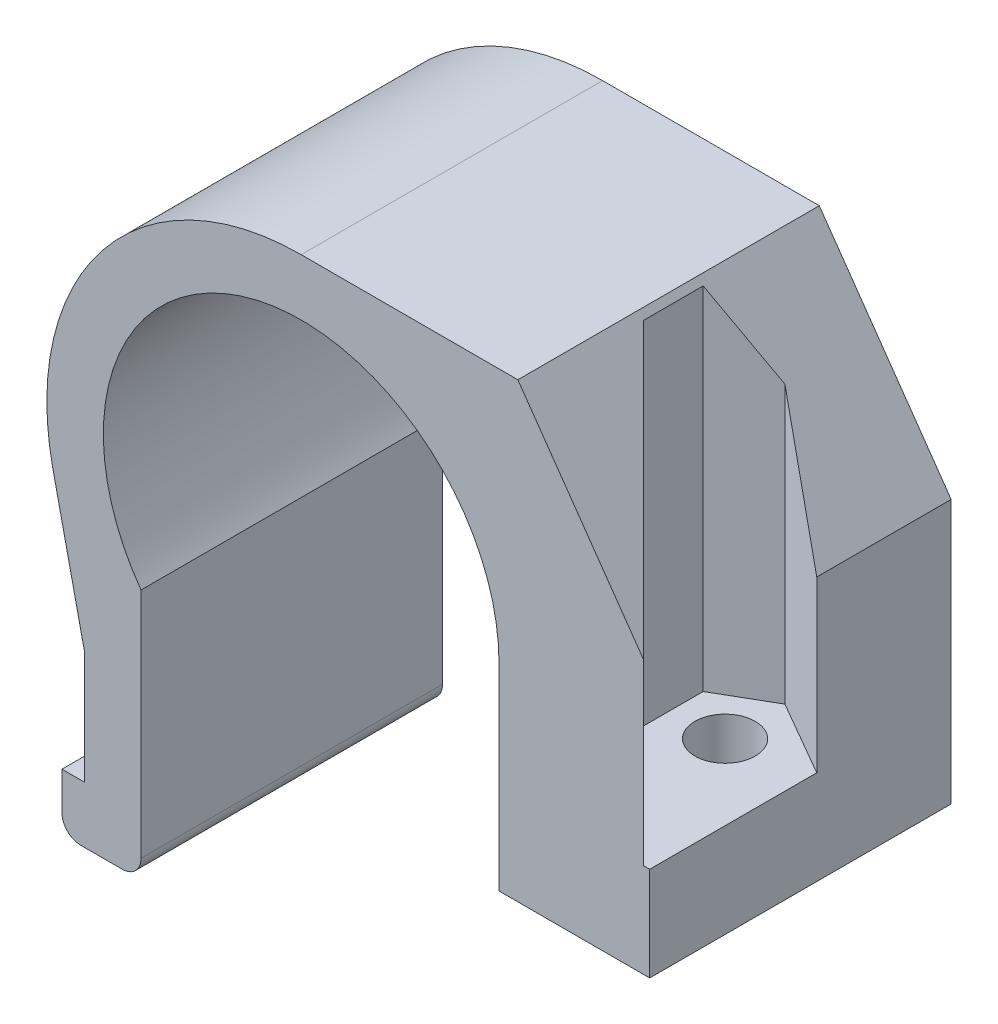
ISO-10303-21;
HEADER;
FILE_DESCRIPTION(('STEP AP214'),'2;1');
FILE_NAME('part.step','',(''),(''),'','','');
FILE_SCHEMA(('AUTOMOTIVE_DESIGN { 1 0 10303 214 1 1 1 1 }'));
ENDSEC;
DATA;
#1=APPLICATION_CONTEXT('core data for automotive mechanical design processes');
#2=APPLICATION_PROTOCOL_DEFINITION('international standard','automotive_design',2000,#1);
#3=PRODUCT_CONTEXT('',#1,'mechanical');
#4=PRODUCT('Part','Part','',(#3));
#5=PRODUCT_RELATED_PRODUCT_CATEGORY('part','',(#4));
#6=PRODUCT_DEFINITION_FORMATION('','',#4);
#7=PRODUCT_DEFINITION_CONTEXT('part definition',#1,'design');
#8=PRODUCT_DEFINITION('design','',#6,#7);
#9=PRODUCT_DEFINITION_SHAPE('','',#8);
#10=(LENGTH_UNIT() NAMED_UNIT(*) SI_UNIT(.MILLI.,.METRE.));
#11=(NAMED_UNIT(*) PLANE_ANGLE_UNIT() SI_UNIT($,.RADIAN.));
#12=(NAMED_UNIT(*) SI_UNIT($,.STERADIAN.) SOLID_ANGLE_UNIT());
#13=UNCERTAINTY_MEASURE_WITH_UNIT(LENGTH_MEASURE(1.E-05),#10,'distance_accuracy_value','');
#14=(GEOMETRIC_REPRESENTATION_CONTEXT(3) GLOBAL_UNCERTAINTY_ASSIGNED_CONTEXT((#13)) GLOBAL_UNIT_ASSIGNED_CONTEXT((#10,
#11,#12)) REPRESENTATION_CONTEXT('',''));
#15=CARTESIAN_POINT('',(0.,0.,0.));
#16=DIRECTION('',(0.,0.,1.));
#17=DIRECTION('',(1.,0.,0.));
#18=AXIS2_PLACEMENT_3D('',#15,#16,#17);
#19=CARTESIAN_POINT('',(14.5,13.5,8.));
#20=DIRECTION('',(0.,-1.,0.));
#21=DIRECTION('',(0.,0.,-1.));
#22=AXIS2_PLACEMENT_3D('',#19,#20,#21);
#23=CYLINDRICAL_SURFACE('',#22,1.6);
#24=CARTESIAN_POINT('',(14.5,-10.5,8.));
#25=DIRECTION('',(0.,-1.,0.));
#26=DIRECTION('',(0.,0.,-1.));
#27=AXIS2_PLACEMENT_3D('',#24,#25,#26);
#28=CIRCLE('',#27,1.6);
#29=CARTESIAN_POINT('',(14.5,-10.5,6.4));
#30=VERTEX_POINT('',#29);
#31=EDGE_CURVE('E257',#30,#30,#28,.T.);
#32=CARTESIAN_POINT('',(14.5,-5.5,8.));
#33=DIRECTION('',(0.,1.,0.));
#34=DIRECTION('',(0.,0.,1.));
#35=AXIS2_PLACEMENT_3D('',#32,#33,#34);
#36=CIRCLE('',#35,1.6);
#37=CARTESIAN_POINT('',(14.5,-5.50000000000001,6.4));
#38=VERTEX_POINT('',#37);
#39=EDGE_CURVE('E244',#38,#38,#36,.F.);
#40=CARTESIAN_POINT('',(14.5,-10.5,6.4));
#41=CARTESIAN_POINT('',(14.5,-10.4479166666667,6.4));
#42=CARTESIAN_POINT('',(14.5,-10.3958333333333,6.4));
#43=CARTESIAN_POINT('',(14.5,-10.2916666666667,6.4));
#44=CARTESIAN_POINT('',(14.5,-10.2395833333333,6.4));
#45=CARTESIAN_POINT('',(14.5,-10.1354166666667,6.4));
#46=CARTESIAN_POINT('',(14.5,-10.0833333333333,6.4));
#47=CARTESIAN_POINT('',(14.5,-9.97916666666667,6.4));
#48=CARTESIAN_POINT('',(14.5,-9.92708333333333,6.4));
#49=CARTESIAN_POINT('',(14.5,-9.82291666666667,6.4));
#50=CARTESIAN_POINT('',(14.5,-9.77083333333333,6.4));
#51=CARTESIAN_POINT('',(14.5,-9.66666666666667,6.4));
#52=CARTESIAN_POINT('',(14.5,-9.61458333333333,6.4));
#53=CARTESIAN_POINT('',(14.5,-9.51041666666667,6.4));
#54=CARTESIAN_POINT('',(14.5,-9.45833333333333,6.4));
#55=CARTESIAN_POINT('',(14.5,-9.35416666666667,6.4));
#56=CARTESIAN_POINT('',(14.5,-9.30208333333333,6.4));
#57=CARTESIAN_POINT('',(14.5,-9.19791666666667,6.4));
#58=CARTESIAN_POINT('',(14.5,-9.14583333333334,6.4));
#59=CARTESIAN_POINT('',(14.5,-9.04166666666667,6.4));
#60=CARTESIAN_POINT('',(14.5,-8.98958333333334,6.4));
#61=CARTESIAN_POINT('',(14.5,-8.88541666666667,6.4));
#62=CARTESIAN_POINT('',(14.5,-8.83333333333334,6.4));
#63=CARTESIAN_POINT('',(14.5,-8.72916666666667,6.4));
#64=CARTESIAN_POINT('',(14.5,-8.67708333333334,6.4));
#65=CARTESIAN_POINT('',(14.5,-8.57291666666667,6.4));
#66=CARTESIAN_POINT('',(14.5,-8.52083333333334,6.4));
#67=CARTESIAN_POINT('',(14.5,-8.41666666666667,6.4));
#68=CARTESIAN_POINT('',(14.5,-8.36458333333334,6.4));
#69=CARTESIAN_POINT('',(14.5,-8.26041666666667,6.4));
#70=CARTESIAN_POINT('',(14.5,-8.20833333333334,6.4));
#71=CARTESIAN_POINT('',(14.5,-8.10416666666667,6.4));
#72=CARTESIAN_POINT('',(14.5,-8.05208333333334,6.4));
#73=CARTESIAN_POINT('',(14.5,-7.94791666666667,6.4));
#74=CARTESIAN_POINT('',(14.5,-7.89583333333334,6.4));
#75=CARTESIAN_POINT('',(14.5,-7.79166666666667,6.4));
#76=CARTESIAN_POINT('',(14.5,-7.73958333333334,6.4));
#77=CARTESIAN_POINT('',(14.5,-7.63541666666667,6.4));
#78=CARTESIAN_POINT('',(14.5,-7.58333333333334,6.4));
#79=CARTESIAN_POINT('',(14.5,-7.47916666666667,6.4));
#80=CARTESIAN_POINT('',(14.5,-7.42708333333334,6.4));
#81=CARTESIAN_POINT('',(14.5,-7.32291666666667,6.4));
#82=CARTESIAN_POINT('',(14.5,-7.27083333333334,6.4));
#83=CARTESIAN_POINT('',(14.5,-7.16666666666667,6.4));
#84=CARTESIAN_POINT('',(14.5,-7.11458333333334,6.4));
#85=CARTESIAN_POINT('',(14.5,-7.01041666666667,6.4));
#86=CARTESIAN_POINT('',(14.5,-6.95833333333334,6.4));
#87=CARTESIAN_POINT('',(14.5,-6.85416666666667,6.4));
#88=CARTESIAN_POINT('',(14.5,-6.80208333333334,6.4));
#89=CARTESIAN_POINT('',(14.5,-6.69791666666667,6.4));
#90=CARTESIAN_POINT('',(14.5,-6.64583333333334,6.4));
#91=CARTESIAN_POINT('',(14.5,-6.54166666666667,6.4));
#92=CARTESIAN_POINT('',(14.5,-6.48958333333334,6.4));
#93=CARTESIAN_POINT('',(14.5,-6.38541666666667,6.4));
#94=CARTESIAN_POINT('',(14.5,-6.33333333333334,6.4));
#95=CARTESIAN_POINT('',(14.5,-6.22916666666667,6.4));
#96=CARTESIAN_POINT('',(14.5,-6.17708333333334,6.4));
#97=CARTESIAN_POINT('',(14.5,-6.07291666666667,6.4));
#98=CARTESIAN_POINT('',(14.5,-6.02083333333334,6.4));
#99=CARTESIAN_POINT('',(14.5,-5.91666666666667,6.4));
#100=CARTESIAN_POINT('',(14.5,-5.86458333333334,6.4));
#101=CARTESIAN_POINT('',(14.5,-5.76041666666667,6.4));
#102=CARTESIAN_POINT('',(14.5,-5.70833333333334,6.4));
#103=CARTESIAN_POINT('',(14.5,-5.60416666666667,6.4));
#104=CARTESIAN_POINT('',(14.5,-5.55208333333334,6.4));
#105=CARTESIAN_POINT('',(14.5,-5.50000000000001,6.4));
#106=B_SPLINE_CURVE_WITH_KNOTS('',3,(#40,#41,#42,#43,#44,#45,#46,#47,#48,#49,#50,#51,#52,#53,
#54,#55,#56,#57,#58,#59,#60,#61,#62,#63,#64,#65,#66,#67,#68,#69,#70,#71,#72,#73,#74,#75,#76,#77,
#78,#79,#80,#81,#82,#83,#84,#85,#86,#87,#88,#89,#90,#91,#92,#93,#94,#95,#96,#97,#98,#99,#100,
#101,#102,#103,#104,#105),.UNSPECIFIED.,.F.,.F.,(4,2,2,2,2,2,2,2,2,2,2,2,2,2,2,2,2,2,2,2,2,2,2,
2,2,2,2,2,2,2,2,2,4),(0.,0.15625,0.3125,0.46875,0.625000000000001,0.781250000000001,
0.937500000000001,1.09375,1.25,1.40625,1.5625,1.71875,1.875,2.03125,2.1875,2.34375,2.5,2.65625,
2.8125,2.96875,3.125,3.28125,3.4375,3.59375,3.75,3.90625,4.0625,4.21875,4.375,4.53125,4.6875,
4.84375,5.),.UNSPECIFIED.);
#107=EDGE_CURVE('BSEAM42',#30,#38,#106,.T.);
#108=ORIENTED_EDGE('',*,*,#31,.T.);
#109=ORIENTED_EDGE('',*,*,#39,.F.);
#110=ORIENTED_EDGE('',*,*,#107,.T.);
#111=ORIENTED_EDGE('',*,*,#107,.F.);
#112=EDGE_LOOP('',(#108,#110,#109,#111));
#113=FACE_BOUND('',#112,.T.);
#114=ADVANCED_FACE('F42',(#113),#23,.F.);
#115=CARTESIAN_POINT('',(-11.6977558947855,-18.5,16.));
#116=DIRECTION('',(0.,0.,-1.));
#117=DIRECTION('',(-1.,0.,0.));
#118=AXIS2_PLACEMENT_3D('',#115,#116,#117);
#119=CYLINDRICAL_SURFACE('',#118,1.);
#120=CARTESIAN_POINT('',(-11.6977558947855,-18.5,0.));
#121=DIRECTION('',(0.,0.,1.));
#122=DIRECTION('',(-1.,0.,0.));
#123=AXIS2_PLACEMENT_3D('',#120,#121,#122);
#124=CIRCLE('',#123,1.);
#125=CARTESIAN_POINT('',(-12.6977558947855,-18.5,0.));
#126=VERTEX_POINT('',#125);
#127=CARTESIAN_POINT('',(-11.6977558947855,-19.5,0.));
#128=VERTEX_POINT('',#127);
#129=EDGE_CURVE('E260',#126,#128,#124,.T.);
#130=ORIENTED_EDGE('',*,*,#129,.T.);
#131=DIRECTION('',(0.,0.,-1.));
#132=VECTOR('',#131,1.);
#133=CARTESIAN_POINT('',(-11.6977558947855,-19.5,16.));
#134=LINE('',#133,#132);
#135=CARTESIAN_POINT('',(-11.6977558947855,-19.5,16.));
#136=VERTEX_POINT('',#135);
#137=EDGE_CURVE('E380',#136,#128,#134,.T.);
#138=ORIENTED_EDGE('',*,*,#137,.F.);
#139=CARTESIAN_POINT('',(-11.6977558947855,-18.5,16.));
#140=DIRECTION('',(0.,0.,1.));
#141=DIRECTION('',(-1.,0.,0.));
#142=AXIS2_PLACEMENT_3D('',#139,#140,#141);
#143=CIRCLE('',#142,1.);
#144=CARTESIAN_POINT('',(-12.6977558947855,-18.5,16.));
#145=VERTEX_POINT('',#144);
#146=EDGE_CURVE('E261',#145,#136,#143,.T.);
#147=ORIENTED_EDGE('',*,*,#146,.F.);
#148=DIRECTION('',(0.,0.,-1.));
#149=VECTOR('',#148,1.);
#150=CARTESIAN_POINT('',(-12.6977558947855,-18.5,16.));
#151=LINE('',#150,#149);
#152=EDGE_CURVE('E303',#145,#126,#151,.T.);
#153=ORIENTED_EDGE('',*,*,#152,.T.);
#154=EDGE_LOOP('',(#130,#138,#147,#153));
#155=FACE_BOUND('',#154,.T.);
#156=ADVANCED_FACE('F447',(#155),#119,.T.);
#157=CARTESIAN_POINT('',(-8.49999999999999,-19.5,16.));
#158=DIRECTION('',(0.,1.,0.));
#159=DIRECTION('',(0.,0.,1.));
#160=AXIS2_PLACEMENT_3D('',#157,#158,#159);
#161=PLANE('',#160);
#162=DIRECTION('',(1.,0.,0.));
#163=VECTOR('',#162,1.);
#164=CARTESIAN_POINT('',(-8.49999999999999,-19.5,0.));
#165=LINE('',#164,#163);
#166=CARTESIAN_POINT('',(-9.49999999999999,-19.5,0.));
#167=VERTEX_POINT('',#166);
#168=EDGE_CURVE('E307',#128,#167,#165,.T.);
#169=ORIENTED_EDGE('',*,*,#168,.T.);
#170=DIRECTION('',(0.,0.,-1.));
#171=VECTOR('',#170,1.);
#172=CARTESIAN_POINT('',(-9.49999999999999,-19.5,16.));
#173=LINE('',#172,#171);
#174=CARTESIAN_POINT('',(-9.49999999999999,-19.5,16.));
#175=VERTEX_POINT('',#174);
#176=EDGE_CURVE('E51',#167,#175,#173,.F.);
#177=ORIENTED_EDGE('',*,*,#176,.T.);
#178=DIRECTION('',(1.,0.,0.));
#179=VECTOR('',#178,1.);
#180=CARTESIAN_POINT('',(-8.49999999999999,-19.5,16.));
#181=LINE('',#180,#179);
#182=EDGE_CURVE('E265',#136,#175,#181,.T.);
#183=ORIENTED_EDGE('',*,*,#182,.F.);
#184=ORIENTED_EDGE('',*,*,#137,.T.);
#185=EDGE_LOOP('',(#169,#177,#183,#184));
#186=FACE_BOUND('',#185,.T.);
#187=ADVANCED_FACE('F453',(#186),#161,.F.);
#188=CARTESIAN_POINT('',(-8.49999999999999,-6.16441400296899,16.));
#189=DIRECTION('',(-1.,0.,0.));
#190=DIRECTION('',(0.,-1.,0.));
#191=AXIS2_PLACEMENT_3D('',#188,#189,#190);
#192=PLANE('',#191);
#193=DIRECTION('',(0.,1.,0.));
#194=VECTOR('',#193,1.);
#195=CARTESIAN_POINT('',(-8.49999999999999,-6.16441400296899,16.));
#196=LINE('',#195,#194);
#197=CARTESIAN_POINT('',(-8.49999999999999,-18.5,16.));
#198=VERTEX_POINT('',#197);
#199=CARTESIAN_POINT('',(-8.49999999999999,-6.16441400296899,16.));
#200=VERTEX_POINT('',#199);
#201=EDGE_CURVE('E269',#198,#200,#196,.T.);
#202=ORIENTED_EDGE('',*,*,#201,.F.);
#203=DIRECTION('',(0.,0.,-1.));
#204=VECTOR('',#203,1.);
#205=CARTESIAN_POINT('',(-8.49999999999999,-18.5,16.));
#206=LINE('',#205,#204);
#207=CARTESIAN_POINT('',(-8.49999999999999,-18.5,0.));
#208=VERTEX_POINT('',#207);
#209=EDGE_CURVE('E411',#198,#208,#206,.T.);
#210=ORIENTED_EDGE('',*,*,#209,.T.);
#211=DIRECTION('',(0.,1.,0.));
#212=VECTOR('',#211,1.);
#213=CARTESIAN_POINT('',(-8.49999999999999,-6.16441400296899,0.));
#214=LINE('',#213,#212);
#215=CARTESIAN_POINT('',(-8.49999999999999,-6.16441400296899,0.));
#216=VERTEX_POINT('',#215);
#217=EDGE_CURVE('E310',#208,#216,#214,.T.);
#218=ORIENTED_EDGE('',*,*,#217,.T.);
#219=DIRECTION('',(0.,0.,-1.));
#220=VECTOR('',#219,1.);
#221=CARTESIAN_POINT('',(-8.49999999999999,-6.16441400296899,16.));
#222=LINE('',#221,#220);
#223=EDGE_CURVE('E376',#200,#216,#222,.T.);
#224=ORIENTED_EDGE('',*,*,#223,.F.);
#225=EDGE_LOOP('',(#202,#210,#218,#224));
#226=FACE_BOUND('',#225,.T.);
#227=ADVANCED_FACE('F420',(#226),#192,.F.);
#228=CARTESIAN_POINT('',(0.,0.,16.));
#229=DIRECTION('',(0.,0.,-1.));
#230=DIRECTION('',(-1.,0.,0.));
#231=AXIS2_PLACEMENT_3D('',#228,#229,#230);
#232=CYLINDRICAL_SURFACE('',#231,10.5);
#233=CARTESIAN_POINT('',(0.,0.,0.));
#234=DIRECTION('',(0.,0.,-1.));
#235=DIRECTION('',(1.,0.,0.));
#236=AXIS2_PLACEMENT_3D('',#233,#234,#235);
#237=CIRCLE('',#236,10.5);
#238=CARTESIAN_POINT('',(10.5,0.,0.));
#239=VERTEX_POINT('',#238);
#240=EDGE_CURVE('E313',#216,#239,#237,.T.);
#241=ORIENTED_EDGE('',*,*,#240,.T.);
#242=DIRECTION('',(0.,0.,-1.));
#243=VECTOR('',#242,1.);
#244=CARTESIAN_POINT('',(10.5,0.,16.));
#245=LINE('',#244,#243);
#246=CARTESIAN_POINT('',(10.5,0.,16.));
#247=VERTEX_POINT('',#246);
#248=EDGE_CURVE('E372',#247,#239,#245,.T.);
#249=ORIENTED_EDGE('',*,*,#248,.F.);
#250=CARTESIAN_POINT('',(0.,0.,16.));
#251=DIRECTION('',(0.,0.,-1.));
#252=DIRECTION('',(1.,0.,0.));
#253=AXIS2_PLACEMENT_3D('',#250,#251,#252);
#254=CIRCLE('',#253,10.5);
#255=EDGE_CURVE('E272',#200,#247,#254,.T.);
#256=ORIENTED_EDGE('',*,*,#255,.F.);
#257=ORIENTED_EDGE('',*,*,#223,.T.);
#258=EDGE_LOOP('',(#241,#249,#256,#257));
#259=FACE_BOUND('',#258,.T.);
#260=ADVANCED_FACE('F430',(#259),#232,.F.);
#261=CARTESIAN_POINT('',(10.5,0.,16.));
#262=DIRECTION('',(1.,0.,0.));
#263=DIRECTION('',(0.,0.,-1.));
#264=AXIS2_PLACEMENT_3D('',#261,#262,#263);
#265=PLANE('',#264);
#266=DIRECTION('',(0.,-1.,0.));
#267=VECTOR('',#266,1.);
#268=CARTESIAN_POINT('',(10.5,0.,0.));
#269=LINE('',#268,#267);
#270=CARTESIAN_POINT('',(10.5,-10.5,0.));
#271=VERTEX_POINT('',#270);
#272=EDGE_CURVE('E316',#239,#271,#269,.T.);
#273=ORIENTED_EDGE('',*,*,#272,.T.);
#274=DIRECTION('',(0.,0.,-1.));
#275=VECTOR('',#274,1.);
#276=CARTESIAN_POINT('',(10.5,-10.5,16.));
#277=LINE('',#276,#275);
#278=CARTESIAN_POINT('',(10.5,-10.5,16.));
#279=VERTEX_POINT('',#278);
#280=EDGE_CURVE('E369',#279,#271,#277,.T.);
#281=ORIENTED_EDGE('',*,*,#280,.F.);
#282=DIRECTION('',(0.,-1.,0.));
#283=VECTOR('',#282,1.);
#284=CARTESIAN_POINT('',(10.5,0.,16.));
#285=LINE('',#284,#283);
#286=EDGE_CURVE('E275',#247,#279,#285,.T.);
#287=ORIENTED_EDGE('',*,*,#286,.F.);
#288=ORIENTED_EDGE('',*,*,#248,.T.);
#289=EDGE_LOOP('',(#273,#281,#287,#288));
#290=FACE_BOUND('',#289,.T.);
#291=ADVANCED_FACE('F434',(#290),#265,.F.);
#292=CARTESIAN_POINT('',(10.5,-10.5,16.));
#293=DIRECTION('',(0.,1.,0.));
#294=DIRECTION('',(-1.,0.,0.));
#295=AXIS2_PLACEMENT_3D('',#292,#293,#294);
#296=PLANE('',#295);
#297=ORIENTED_EDGE('',*,*,#31,.F.);
#298=EDGE_LOOP('',(#297));
#299=FACE_BOUND('',#298,.T.);
#300=DIRECTION('',(1.,0.,0.));
#301=VECTOR('',#300,1.);
#302=CARTESIAN_POINT('',(10.5,-10.5,0.));
#303=LINE('',#302,#301);
#304=CARTESIAN_POINT('',(18.5,-10.5,0.));
#305=VERTEX_POINT('',#304);
#306=EDGE_CURVE('E319',#271,#305,#303,.T.);
#307=ORIENTED_EDGE('',*,*,#306,.T.);
#308=DIRECTION('',(0.,0.,-1.));
#309=VECTOR('',#308,1.);
#310=CARTESIAN_POINT('',(18.5,-10.5,16.));
#311=LINE('',#310,#309);
#312=CARTESIAN_POINT('',(18.5,-10.5,16.));
#313=VERTEX_POINT('',#312);
#314=EDGE_CURVE('E365',#313,#305,#311,.T.);
#315=ORIENTED_EDGE('',*,*,#314,.F.);
#316=DIRECTION('',(1.,0.,0.));
#317=VECTOR('',#316,1.);
#318=CARTESIAN_POINT('',(10.5,-10.5,16.));
#319=LINE('',#318,#317);
#320=EDGE_CURVE('E278',#279,#313,#319,.T.);
#321=ORIENTED_EDGE('',*,*,#320,.F.);
#322=ORIENTED_EDGE('',*,*,#280,.T.);
#323=EDGE_LOOP('',(#307,#315,#321,#322));
#324=FACE_BOUND('',#323,.T.);
#325=ADVANCED_FACE('F491',(#299,#324),#296,.F.);
#326=CARTESIAN_POINT('',(18.5,13.5,16.));
#327=DIRECTION('',(-1.,0.,0.));
#328=DIRECTION('',(0.,-1.,0.));
#329=AXIS2_PLACEMENT_3D('',#326,#327,#328);
#330=PLANE('',#329);
#331=DIRECTION('',(0.,0.,1.));
#332=VECTOR('',#331,1.);
#333=CARTESIAN_POINT('',(18.5,3.49999999999996,16.));
#334=LINE('',#333,#332);
#335=CARTESIAN_POINT('',(18.5,3.49999999999996,0.));
#336=VERTEX_POINT('',#335);
#337=CARTESIAN_POINT('',(18.5,3.49999999999996,7.13397459621556));
#338=VERTEX_POINT('',#337);
#339=EDGE_CURVE('E391',#336,#338,#334,.T.);
#340=ORIENTED_EDGE('',*,*,#339,.T.);
#341=DIRECTION('',(0.,-1.,0.));
#342=VECTOR('',#341,1.);
#343=CARTESIAN_POINT('',(18.5,13.5,7.13397459621556));
#344=LINE('',#343,#342);
#345=CARTESIAN_POINT('',(18.5,-5.5,7.13397459621556));
#346=VERTEX_POINT('',#345);
#347=EDGE_CURVE('E253',#338,#346,#344,.T.);
#348=ORIENTED_EDGE('',*,*,#347,.T.);
#349=DIRECTION('',(0.,0.,-1.));
#350=VECTOR('',#349,1.);
#351=CARTESIAN_POINT('',(18.5,-5.5,16.));
#352=LINE('',#351,#350);
#353=CARTESIAN_POINT('',(18.5,-5.5,16.));
#354=VERTEX_POINT('',#353);
#355=EDGE_CURVE('E249',#354,#346,#352,.T.);
#356=ORIENTED_EDGE('',*,*,#355,.F.);
#357=DIRECTION('',(0.,1.,0.));
#358=VECTOR('',#357,1.);
#359=CARTESIAN_POINT('',(18.5,13.5,16.));
#360=LINE('',#359,#358);
#361=EDGE_CURVE('E281',#313,#354,#360,.T.);
#362=ORIENTED_EDGE('',*,*,#361,.F.);
#363=ORIENTED_EDGE('',*,*,#314,.T.);
#364=DIRECTION('',(0.,1.,0.));
#365=VECTOR('',#364,1.);
#366=CARTESIAN_POINT('',(18.5,13.5,0.));
#367=LINE('',#366,#365);
#368=EDGE_CURVE('E321',#305,#336,#367,.T.);
#369=ORIENTED_EDGE('',*,*,#368,.T.);
#370=EDGE_LOOP('',(#340,#348,#356,#362,#363,#369));
#371=FACE_BOUND('',#370,.T.);
#372=ADVANCED_FACE('F487',(#371),#330,.F.);
#373=CARTESIAN_POINT('',(0.,13.5,16.));
#374=DIRECTION('',(0.,-1.,0.));
#375=DIRECTION('',(1.,0.,0.));
#376=AXIS2_PLACEMENT_3D('',#373,#374,#375);
#377=PLANE('',#376);
#378=DIRECTION('',(-1.,0.,0.));
#379=VECTOR('',#378,1.);
#380=CARTESIAN_POINT('',(0.,13.5,16.));
#381=LINE('',#380,#379);
#382=CARTESIAN_POINT('',(11.5,13.5,16.));
#383=VERTEX_POINT('',#382);
#384=CARTESIAN_POINT('',(0.,13.5,16.));
#385=VERTEX_POINT('',#384);
#386=EDGE_CURVE('E285',#383,#385,#381,.T.);
#387=ORIENTED_EDGE('',*,*,#386,.F.);
#388=DIRECTION('',(0.,0.,-1.));
#389=VECTOR('',#388,1.);
#390=CARTESIAN_POINT('',(11.5,13.5,16.));
#391=LINE('',#390,#389);
#392=CARTESIAN_POINT('',(11.5,13.5,0.));
#393=VERTEX_POINT('',#392);
#394=EDGE_CURVE('E384',#383,#393,#391,.T.);
#395=ORIENTED_EDGE('',*,*,#394,.T.);
#396=DIRECTION('',(-1.,0.,0.));
#397=VECTOR('',#396,1.);
#398=CARTESIAN_POINT('',(0.,13.5,0.));
#399=LINE('',#398,#397);
#400=CARTESIAN_POINT('',(0.,13.5,0.));
#401=VERTEX_POINT('',#400);
#402=EDGE_CURVE('E325',#393,#401,#399,.T.);
#403=ORIENTED_EDGE('',*,*,#402,.T.);
#404=DIRECTION('',(0.,0.,-1.));
#405=VECTOR('',#404,1.);
#406=CARTESIAN_POINT('',(0.,13.5,16.));
#407=LINE('',#406,#405);
#408=EDGE_CURVE('E361',#385,#401,#407,.T.);
#409=ORIENTED_EDGE('',*,*,#408,.F.);
#410=EDGE_LOOP('',(#387,#395,#403,#409));
#411=FACE_BOUND('',#410,.T.);
#412=ADVANCED_FACE('F483',(#411),#377,.F.);
#413=CARTESIAN_POINT('',(0.,0.,16.));
#414=DIRECTION('',(0.,0.,-1.));
#415=DIRECTION('',(-1.,0.,0.));
#416=AXIS2_PLACEMENT_3D('',#413,#414,#415);
#417=CYLINDRICAL_SURFACE('',#416,13.5);
#418=CARTESIAN_POINT('',(0.,0.,0.));
#419=DIRECTION('',(0.,0.,1.));
#420=DIRECTION('',(1.,0.,0.));
#421=AXIS2_PLACEMENT_3D('',#418,#419,#420);
#422=CIRCLE('',#421,13.5);
#423=CARTESIAN_POINT('',(-13.1800036354533,-2.92190078021782,0.));
#424=VERTEX_POINT('',#423);
#425=EDGE_CURVE('E328',#401,#424,#422,.T.);
#426=ORIENTED_EDGE('',*,*,#425,.T.);
#427=DIRECTION('',(0.,0.,-1.));
#428=VECTOR('',#427,1.);
#429=CARTESIAN_POINT('',(-13.1800036354533,-2.92190078021782,16.));
#430=LINE('',#429,#428);
#431=CARTESIAN_POINT('',(-13.1800036354533,-2.92190078021782,16.));
#432=VERTEX_POINT('',#431);
#433=EDGE_CURVE('E357',#432,#424,#430,.T.);
#434=ORIENTED_EDGE('',*,*,#433,.F.);
#435=CARTESIAN_POINT('',(0.,0.,16.));
#436=DIRECTION('',(0.,0.,1.));
#437=DIRECTION('',(1.,0.,0.));
#438=AXIS2_PLACEMENT_3D('',#435,#436,#437);
#439=CIRCLE('',#438,13.5);
#440=EDGE_CURVE('E288',#385,#432,#439,.T.);
#441=ORIENTED_EDGE('',*,*,#440,.F.);
#442=ORIENTED_EDGE('',*,*,#408,.T.);
#443=EDGE_LOOP('',(#426,#434,#441,#442));
#444=FACE_BOUND('',#443,.T.);
#445=ADVANCED_FACE('F479',(#444),#417,.T.);
#446=CARTESIAN_POINT('',(-11.5,-10.5,16.));
#447=DIRECTION('',(0.976296565589134,0.21643709483095,0.));
#448=DIRECTION('',(-0.21643709483095,0.976296565589134,0.));
#449=AXIS2_PLACEMENT_3D('',#446,#447,#448);
#450=PLANE('',#449);
#451=DIRECTION('',(0.216437094830949,-0.976296565589134,0.));
#452=VECTOR('',#451,1.);
#453=CARTESIAN_POINT('',(-11.5,-10.5,0.));
#454=LINE('',#453,#452);
#455=CARTESIAN_POINT('',(-11.5,-10.5,0.));
#456=VERTEX_POINT('',#455);
#457=EDGE_CURVE('E331',#424,#456,#454,.T.);
#458=ORIENTED_EDGE('',*,*,#457,.T.);
#459=DIRECTION('',(0.,0.,-1.));
#460=VECTOR('',#459,1.);
#461=CARTESIAN_POINT('',(-11.5,-10.5,16.));
#462=LINE('',#461,#460);
#463=CARTESIAN_POINT('',(-11.5,-10.5,16.));
#464=VERTEX_POINT('',#463);
#465=EDGE_CURVE('E353',#464,#456,#462,.T.);
#466=ORIENTED_EDGE('',*,*,#465,.F.);
#467=DIRECTION('',(0.216437094830949,-0.976296565589134,0.));
#468=VECTOR('',#467,1.);
#469=CARTESIAN_POINT('',(-11.5,-10.5,16.));
#470=LINE('',#469,#468);
#471=EDGE_CURVE('E291',#432,#464,#470,.T.);
#472=ORIENTED_EDGE('',*,*,#471,.F.);
#473=ORIENTED_EDGE('',*,*,#433,.T.);
#474=EDGE_LOOP('',(#458,#466,#472,#473));
#475=FACE_BOUND('',#474,.T.);
#476=ADVANCED_FACE('F475',(#475),#450,.F.);
#477=CARTESIAN_POINT('',(-11.5,-16.5,16.));
#478=DIRECTION('',(1.,0.,0.));
#479=DIRECTION('',(0.,1.,0.));
#480=AXIS2_PLACEMENT_3D('',#477,#478,#479);
#481=PLANE('',#480);
#482=DIRECTION('',(0.,-1.,0.));
#483=VECTOR('',#482,1.);
#484=CARTESIAN_POINT('',(-11.5,-16.5,0.));
#485=LINE('',#484,#483);
#486=CARTESIAN_POINT('',(-11.5,-16.5,0.));
#487=VERTEX_POINT('',#486);
#488=EDGE_CURVE('E334',#456,#487,#485,.T.);
#489=ORIENTED_EDGE('',*,*,#488,.T.);
#490=DIRECTION('',(0.,0.,-1.));
#491=VECTOR('',#490,1.);
#492=CARTESIAN_POINT('',(-11.5,-16.5,16.));
#493=LINE('',#492,#491);
#494=CARTESIAN_POINT('',(-11.5,-16.5,16.));
#495=VERTEX_POINT('',#494);
#496=EDGE_CURVE('E349',#495,#487,#493,.T.);
#497=ORIENTED_EDGE('',*,*,#496,.F.);
#498=DIRECTION('',(0.,-1.,0.));
#499=VECTOR('',#498,1.);
#500=CARTESIAN_POINT('',(-11.5,-16.5,16.));
#501=LINE('',#500,#499);
#502=EDGE_CURVE('E294',#464,#495,#501,.T.);
#503=ORIENTED_EDGE('',*,*,#502,.F.);
#504=ORIENTED_EDGE('',*,*,#465,.T.);
#505=EDGE_LOOP('',(#489,#497,#503,#504));
#506=FACE_BOUND('',#505,.T.);
#507=ADVANCED_FACE('F471',(#506),#481,.F.);
#508=CARTESIAN_POINT('',(-12.6977558947855,-16.5,16.));
#509=DIRECTION('',(0.,-1.,0.));
#510=DIRECTION('',(0.,0.,-1.));
#511=AXIS2_PLACEMENT_3D('',#508,#509,#510);
#512=PLANE('',#511);
#513=DIRECTION('',(-1.,0.,0.));
#514=VECTOR('',#513,1.);
#515=CARTESIAN_POINT('',(-12.6977558947855,-16.5,0.));
#516=LINE('',#515,#514);
#517=CARTESIAN_POINT('',(-12.6977558947855,-16.5,0.));
#518=VERTEX_POINT('',#517);
#519=EDGE_CURVE('E337',#487,#518,#516,.T.);
#520=ORIENTED_EDGE('',*,*,#519,.T.);
#521=DIRECTION('',(0.,0.,-1.));
#522=VECTOR('',#521,1.);
#523=CARTESIAN_POINT('',(-12.6977558947855,-16.5,16.));
#524=LINE('',#523,#522);
#525=CARTESIAN_POINT('',(-12.6977558947855,-16.5,16.));
#526=VERTEX_POINT('',#525);
#527=EDGE_CURVE('E345',#526,#518,#524,.T.);
#528=ORIENTED_EDGE('',*,*,#527,.F.);
#529=DIRECTION('',(-1.,0.,0.));
#530=VECTOR('',#529,1.);
#531=CARTESIAN_POINT('',(-12.6977558947855,-16.5,16.));
#532=LINE('',#531,#530);
#533=EDGE_CURVE('E297',#495,#526,#532,.T.);
#534=ORIENTED_EDGE('',*,*,#533,.F.);
#535=ORIENTED_EDGE('',*,*,#496,.T.);
#536=EDGE_LOOP('',(#520,#528,#534,#535));
#537=FACE_BOUND('',#536,.T.);
#538=ADVANCED_FACE('F467',(#537),#512,.F.);
#539=CARTESIAN_POINT('',(-12.6977558947855,-16.5,16.));
#540=DIRECTION('',(1.,0.,0.));
#541=DIRECTION('',(0.,1.,0.));
#542=AXIS2_PLACEMENT_3D('',#539,#540,#541);
#543=PLANE('',#542);
#544=DIRECTION('',(0.,-1.,0.));
#545=VECTOR('',#544,1.);
#546=CARTESIAN_POINT('',(-12.6977558947855,-16.5,0.));
#547=LINE('',#546,#545);
#548=EDGE_CURVE('E266',#518,#126,#547,.T.);
#549=ORIENTED_EDGE('',*,*,#548,.T.);
#550=ORIENTED_EDGE('',*,*,#152,.F.);
#551=DIRECTION('',(0.,-1.,0.));
#552=VECTOR('',#551,1.);
#553=CARTESIAN_POINT('',(-12.6977558947855,-16.5,16.));
#554=LINE('',#553,#552);
#555=EDGE_CURVE('E300',#526,#145,#554,.T.);
#556=ORIENTED_EDGE('',*,*,#555,.F.);
#557=ORIENTED_EDGE('',*,*,#527,.T.);
#558=EDGE_LOOP('',(#549,#550,#556,#557));
#559=FACE_BOUND('',#558,.T.);
#560=ADVANCED_FACE('F461',(#559),#543,.F.);
#561=CARTESIAN_POINT('',(-11.6977558947855,-18.5,16.));
#562=DIRECTION('',(0.,0.,-1.));
#563=DIRECTION('',(-1.,0.,0.));
#564=AXIS2_PLACEMENT_3D('',#561,#562,#563);
#565=PLANE('',#564);
#566=ORIENTED_EDGE('',*,*,#182,.T.);
#567=CARTESIAN_POINT('',(-9.49999999999999,-18.5,16.));
#568=DIRECTION('',(0.,0.,-1.));
#569=DIRECTION('',(-1.,0.,0.));
#570=AXIS2_PLACEMENT_3D('',#567,#568,#569);
#571=CIRCLE('',#570,1.);
#572=EDGE_CURVE('E11',#175,#198,#571,.F.);
#573=ORIENTED_EDGE('',*,*,#572,.T.);
#574=ORIENTED_EDGE('',*,*,#201,.T.);
#575=ORIENTED_EDGE('',*,*,#255,.T.);
#576=ORIENTED_EDGE('',*,*,#286,.T.);
#577=ORIENTED_EDGE('',*,*,#320,.T.);
#578=ORIENTED_EDGE('',*,*,#361,.T.);
#579=DIRECTION('',(1.,0.,0.));
#580=VECTOR('',#579,1.);
#581=CARTESIAN_POINT('',(-11.6977558947855,-5.5,16.));
#582=LINE('',#581,#580);
#583=CARTESIAN_POINT('',(18.1622867597285,-5.5,16.));
#584=VERTEX_POINT('',#583);
#585=EDGE_CURVE('E247',#584,#354,#582,.T.);
#586=ORIENTED_EDGE('',*,*,#585,.F.);
#587=DIRECTION('',(0.,1.,0.));
#588=VECTOR('',#587,1.);
#589=CARTESIAN_POINT('',(18.1622867597285,-18.5,16.));
#590=LINE('',#589,#588);
#591=CARTESIAN_POINT('',(18.1622867597285,3.98244748610204,16.));
#592=VERTEX_POINT('',#591);
#593=EDGE_CURVE('E227',#584,#592,#590,.T.);
#594=ORIENTED_EDGE('',*,*,#593,.T.);
#595=DIRECTION('',(0.573462344363328,-0.819231920519041,0.));
#596=VECTOR('',#595,1.);
#597=CARTESIAN_POINT('',(11.5,13.5,16.));
#598=LINE('',#597,#596);
#599=EDGE_CURVE('E395',#592,#383,#598,.F.);
#600=ORIENTED_EDGE('',*,*,#599,.T.);
#601=ORIENTED_EDGE('',*,*,#386,.T.);
#602=ORIENTED_EDGE('',*,*,#440,.T.);
#603=ORIENTED_EDGE('',*,*,#471,.T.);
#604=ORIENTED_EDGE('',*,*,#502,.T.);
#605=ORIENTED_EDGE('',*,*,#533,.T.);
#606=ORIENTED_EDGE('',*,*,#555,.T.);
#607=ORIENTED_EDGE('',*,*,#146,.T.);
#608=EDGE_LOOP('',(#566,#573,#574,#575,#576,#577,#578,#586,#594,#600,#601,#602,#603,#604,#605,
#606,#607));
#609=FACE_BOUND('',#608,.T.);
#610=ADVANCED_FACE('F438',(#609),#565,.F.);
#611=CARTESIAN_POINT('',(-11.6977558947855,-18.5,0.));
#612=DIRECTION('',(0.,0.,-1.));
#613=DIRECTION('',(-1.,0.,0.));
#614=AXIS2_PLACEMENT_3D('',#611,#612,#613);
#615=PLANE('',#614);
#616=ORIENTED_EDGE('',*,*,#217,.F.);
#617=CARTESIAN_POINT('',(-9.49999999999999,-18.5,0.));
#618=DIRECTION('',(0.,0.,-1.));
#619=DIRECTION('',(-1.,0.,0.));
#620=AXIS2_PLACEMENT_3D('',#617,#618,#619);
#621=CIRCLE('',#620,1.);
#622=EDGE_CURVE('E71',#208,#167,#621,.T.);
#623=ORIENTED_EDGE('',*,*,#622,.T.);
#624=ORIENTED_EDGE('',*,*,#168,.F.);
#625=ORIENTED_EDGE('',*,*,#129,.F.);
#626=ORIENTED_EDGE('',*,*,#548,.F.);
#627=ORIENTED_EDGE('',*,*,#519,.F.);
#628=ORIENTED_EDGE('',*,*,#488,.F.);
#629=ORIENTED_EDGE('',*,*,#457,.F.);
#630=ORIENTED_EDGE('',*,*,#425,.F.);
#631=ORIENTED_EDGE('',*,*,#402,.F.);
#632=DIRECTION('',(-0.573462344363328,0.819231920519041,0.));
#633=VECTOR('',#632,1.);
#634=CARTESIAN_POINT('',(18.9047648399699,2.92176451432872,0.));
#635=LINE('',#634,#633);
#636=EDGE_CURVE('E388',#393,#336,#635,.F.);
#637=ORIENTED_EDGE('',*,*,#636,.T.);
#638=ORIENTED_EDGE('',*,*,#368,.F.);
#639=ORIENTED_EDGE('',*,*,#306,.F.);
#640=ORIENTED_EDGE('',*,*,#272,.F.);
#641=ORIENTED_EDGE('',*,*,#240,.F.);
#642=EDGE_LOOP('',(#616,#623,#624,#625,#626,#627,#628,#629,#630,#631,#637,#638,#639,#640,#641));
#643=FACE_BOUND('',#642,.T.);
#644=ADVANCED_FACE('F425',(#643),#615,.T.);
#645=CARTESIAN_POINT('',(11.5,13.5,16.));
#646=DIRECTION('',(-0.819231920519041,-0.573462344363328,0.));
#647=DIRECTION('',(0.,0.,-1.));
#648=AXIS2_PLACEMENT_3D('',#645,#646,#647);
#649=PLANE('',#648);
#650=DIRECTION('',(0.544399639733473,-0.777713771047819,0.314309278546856));
#651=VECTOR('',#650,1.);
#652=CARTESIAN_POINT('',(13.7085966059818,10.3448619914545,4.36765655688308));
#653=LINE('',#652,#651);
#654=CARTESIAN_POINT('',(14.5,9.21428571428568,4.82457351945706));
#655=VERTEX_POINT('',#654);
#656=EDGE_CURVE('E408',#338,#655,#653,.F.);
#657=ORIENTED_EDGE('',*,*,#656,.F.);
#658=ORIENTED_EDGE('',*,*,#339,.F.);
#659=ORIENTED_EDGE('',*,*,#636,.F.);
#660=ORIENTED_EDGE('',*,*,#394,.F.);
#661=ORIENTED_EDGE('',*,*,#599,.F.);
#662=DIRECTION('',(-0.497468338163091,0.710669054518702,-0.49746833816309));
#663=VECTOR('',#662,1.);
#664=CARTESIAN_POINT('',(13.1487477334682,11.1446460950455,10.9864609737396));
#665=LINE('',#664,#663);
#666=CARTESIAN_POINT('',(11.75,13.1428571428571,9.58771324027147));
#667=VERTEX_POINT('',#666);
#668=EDGE_CURVE('E398',#667,#592,#665,.F.);
#669=ORIENTED_EDGE('',*,*,#668,.F.);
#670=DIRECTION('',(0.,0.,-1.));
#671=VECTOR('',#670,1.);
#672=CARTESIAN_POINT('',(11.75,13.1428571428571,16.));
#673=LINE('',#672,#671);
#674=CARTESIAN_POINT('',(11.75,13.1428571428571,6.41228675972853));
#675=VERTEX_POINT('',#674);
#676=EDGE_CURVE('E216',#675,#667,#673,.F.);
#677=ORIENTED_EDGE('',*,*,#676,.F.);
#678=DIRECTION('',(0.544399639733473,-0.77771377104782,-0.314309278546856));
#679=VECTOR('',#678,1.);
#680=CARTESIAN_POINT('',(9.884145329502,15.8083638149971,7.48953845600927));
#681=LINE('',#680,#679);
#682=EDGE_CURVE('E405',#655,#675,#681,.F.);
#683=ORIENTED_EDGE('',*,*,#682,.F.);
#684=EDGE_LOOP('',(#657,#658,#659,#660,#661,#669,#677,#683));
#685=FACE_BOUND('',#684,.T.);
#686=ADVANCED_FACE('F464',(#685),#649,.F.);
#687=CARTESIAN_POINT('',(17.25,13.5,6.41228675972853));
#688=DIRECTION('',(0.5,0.,-0.866025403784438));
#689=DIRECTION('',(-0.866025403784439,0.,-0.5));
#690=AXIS2_PLACEMENT_3D('',#687,#688,#689);
#691=PLANE('',#690);
#692=ORIENTED_EDGE('',*,*,#656,.T.);
#693=DIRECTION('',(0.,-1.,0.));
#694=VECTOR('',#693,1.);
#695=CARTESIAN_POINT('',(14.5,13.5,4.82457351945706));
#696=LINE('',#695,#694);
#697=CARTESIAN_POINT('',(14.5,-5.5,4.82457351945706));
#698=VERTEX_POINT('',#697);
#699=EDGE_CURVE('E241',#655,#698,#696,.T.);
#700=ORIENTED_EDGE('',*,*,#699,.T.);
#701=DIRECTION('',(0.866025403784438,0.,0.5));
#702=VECTOR('',#701,1.);
#703=CARTESIAN_POINT('',(17.25,-5.5,6.41228675972853));
#704=LINE('',#703,#702);
#705=EDGE_CURVE('E221',#698,#346,#704,.T.);
#706=ORIENTED_EDGE('',*,*,#705,.T.);
#707=ORIENTED_EDGE('',*,*,#347,.F.);
#708=EDGE_LOOP('',(#692,#700,#706,#707));
#709=FACE_BOUND('',#708,.T.);
#710=ADVANCED_FACE('F504',(#709),#691,.F.);
#711=CARTESIAN_POINT('',(19.6091363356852,13.5,17.4468495759566));
#712=DIRECTION('',(-0.707106781186547,0.,0.707106781186548));
#713=DIRECTION('',(0.707106781186548,0.,0.707106781186547));
#714=AXIS2_PLACEMENT_3D('',#711,#712,#713);
#715=PLANE('',#714);
#716=DIRECTION('',(-0.707106781186548,0.,-0.707106781186547));
#717=VECTOR('',#716,1.);
#718=CARTESIAN_POINT('',(19.6091363356852,-5.5,17.4468495759566));
#719=LINE('',#718,#717);
#720=CARTESIAN_POINT('',(11.75,-5.5,9.58771324027147));
#721=VERTEX_POINT('',#720);
#722=EDGE_CURVE('E224',#584,#721,#719,.T.);
#723=ORIENTED_EDGE('',*,*,#722,.T.);
#724=DIRECTION('',(0.,-1.,0.));
#725=VECTOR('',#724,1.);
#726=CARTESIAN_POINT('',(11.75,13.5,9.58771324027147));
#727=LINE('',#726,#725);
#728=EDGE_CURVE('E209',#667,#721,#727,.T.);
#729=ORIENTED_EDGE('',*,*,#728,.F.);
#730=ORIENTED_EDGE('',*,*,#668,.T.);
#731=ORIENTED_EDGE('',*,*,#593,.F.);
#732=EDGE_LOOP('',(#723,#729,#730,#731));
#733=FACE_BOUND('',#732,.T.);
#734=ADVANCED_FACE('F225',(#733),#715,.F.);
#735=CARTESIAN_POINT('',(0.,-5.5,0.));
#736=DIRECTION('',(0.,1.,0.));
#737=DIRECTION('',(0.,0.,1.));
#738=AXIS2_PLACEMENT_3D('',#735,#736,#737);
#739=PLANE('',#738);
#740=ORIENTED_EDGE('',*,*,#39,.T.);
#741=EDGE_LOOP('',(#740));
#742=FACE_BOUND('',#741,.T.);
#743=ORIENTED_EDGE('',*,*,#355,.T.);
#744=ORIENTED_EDGE('',*,*,#705,.F.);
#745=DIRECTION('',(0.866025403784439,0.,-0.5));
#746=VECTOR('',#745,1.);
#747=CARTESIAN_POINT('',(11.75,-5.5,6.41228675972853));
#748=LINE('',#747,#746);
#749=CARTESIAN_POINT('',(11.75,-5.5,6.41228675972853));
#750=VERTEX_POINT('',#749);
#751=EDGE_CURVE('E235',#750,#698,#748,.T.);
#752=ORIENTED_EDGE('',*,*,#751,.F.);
#753=DIRECTION('',(0.,0.,-1.));
#754=VECTOR('',#753,1.);
#755=CARTESIAN_POINT('',(11.75,-5.5,9.58771324027147));
#756=LINE('',#755,#754);
#757=EDGE_CURVE('E214',#721,#750,#756,.T.);
#758=ORIENTED_EDGE('',*,*,#757,.F.);
#759=ORIENTED_EDGE('',*,*,#722,.F.);
#760=ORIENTED_EDGE('',*,*,#585,.T.);
#761=EDGE_LOOP('',(#743,#744,#752,#758,#759,#760));
#762=FACE_BOUND('',#761,.T.);
#763=ADVANCED_FACE('F232',(#742,#762),#739,.T.);
#764=CARTESIAN_POINT('',(11.75,13.5,6.41228675972853));
#765=DIRECTION('',(-0.5,0.,-0.866025403784439));
#766=DIRECTION('',(-0.866025403784439,0.,0.5));
#767=AXIS2_PLACEMENT_3D('',#764,#765,#766);
#768=PLANE('',#767);
#769=ORIENTED_EDGE('',*,*,#682,.T.);
#770=DIRECTION('',(0.,-1.,0.));
#771=VECTOR('',#770,1.);
#772=CARTESIAN_POINT('',(11.75,13.5,6.41228675972853));
#773=LINE('',#772,#771);
#774=EDGE_CURVE('E220',#675,#750,#773,.T.);
#775=ORIENTED_EDGE('',*,*,#774,.T.);
#776=ORIENTED_EDGE('',*,*,#751,.T.);
#777=ORIENTED_EDGE('',*,*,#699,.F.);
#778=EDGE_LOOP('',(#769,#775,#776,#777));
#779=FACE_BOUND('',#778,.T.);
#780=ADVANCED_FACE('F444',(#779),#768,.F.);
#781=CARTESIAN_POINT('',(11.75,13.5,9.58771324027147));
#782=DIRECTION('',(-1.,0.,0.));
#783=DIRECTION('',(0.,0.,1.));
#784=AXIS2_PLACEMENT_3D('',#781,#782,#783);
#785=PLANE('',#784);
#786=ORIENTED_EDGE('',*,*,#676,.T.);
#787=ORIENTED_EDGE('',*,*,#728,.T.);
#788=ORIENTED_EDGE('',*,*,#757,.T.);
#789=ORIENTED_EDGE('',*,*,#774,.F.);
#790=EDGE_LOOP('',(#786,#787,#788,#789));
#791=FACE_BOUND('',#790,.T.);
#792=ADVANCED_FACE('F211',(#791),#785,.F.);
#793=CARTESIAN_POINT('',(-9.49999999999999,-18.5,16.));
#794=DIRECTION('',(0.,0.,-1.));
#795=DIRECTION('',(-1.,0.,0.));
#796=AXIS2_PLACEMENT_3D('',#793,#794,#795);
#797=CYLINDRICAL_SURFACE('',#796,1.);
#798=ORIENTED_EDGE('',*,*,#572,.F.);
#799=ORIENTED_EDGE('',*,*,#176,.F.);
#800=ORIENTED_EDGE('',*,*,#622,.F.);
#801=ORIENTED_EDGE('',*,*,#209,.F.);
#802=EDGE_LOOP('',(#798,#799,#800,#801));
#803=FACE_BOUND('',#802,.T.);
#804=ADVANCED_FACE('F44',(#803),#797,.T.);
#805=CLOSED_SHELL('',(#114,#156,#187,#227,#260,#291,#325,#372,#412,#445,#476,#507,#538,#560,
#610,#644,#686,#710,#734,#763,#780,#792,#804));
#806=MANIFOLD_SOLID_BREP('B2',#805);
#807=ADVANCED_BREP_SHAPE_REPRESENTATION('',(#18,#806),#14);
#808=SHAPE_DEFINITION_REPRESENTATION(#9,#807);
ENDSEC;
END-ISO-10303-21;
